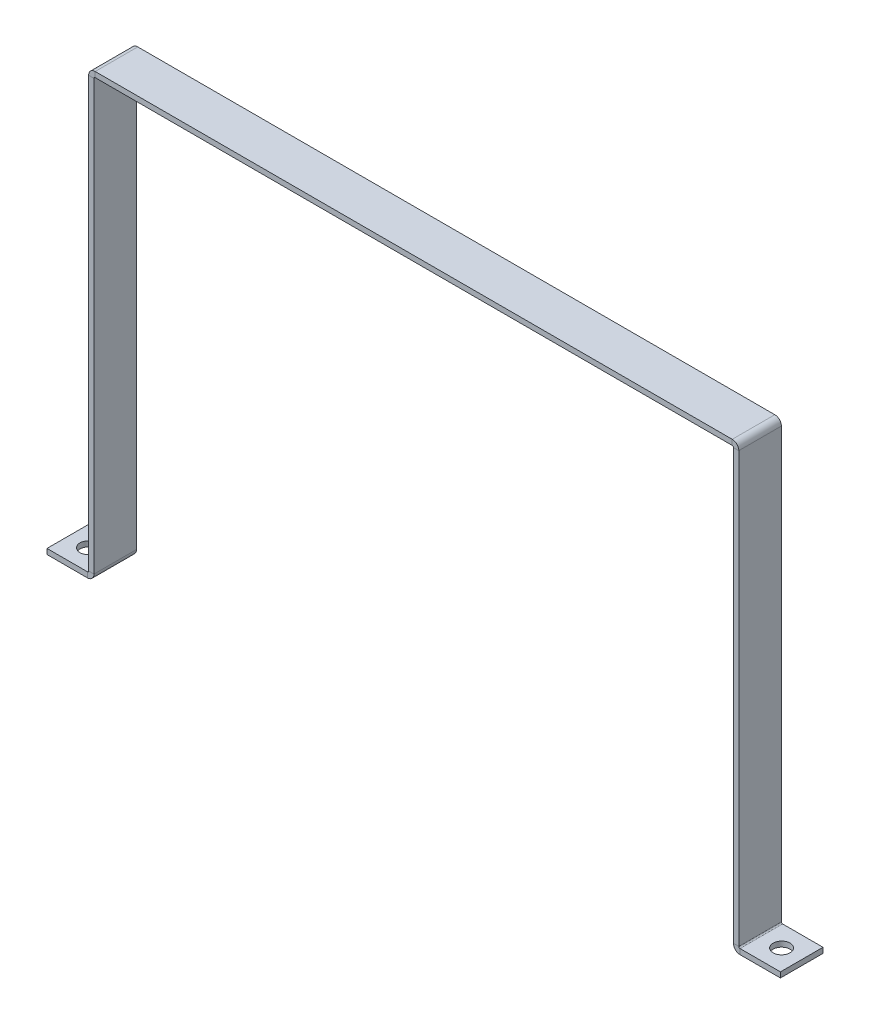
ISO-10303-21;
HEADER;
FILE_DESCRIPTION(('STEP AP214'),'2;1');
FILE_NAME('part.step','',(''),(''),'','','');
FILE_SCHEMA(('AUTOMOTIVE_DESIGN { 1 0 10303 214 1 1 1 1 }'));
ENDSEC;
DATA;
#1=APPLICATION_CONTEXT('core data for automotive mechanical design processes');
#2=APPLICATION_PROTOCOL_DEFINITION('international standard','automotive_design',2000,#1);
#3=PRODUCT_CONTEXT('',#1,'mechanical');
#4=PRODUCT('Part','Part','',(#3));
#5=PRODUCT_RELATED_PRODUCT_CATEGORY('part','',(#4));
#6=PRODUCT_DEFINITION_FORMATION('','',#4);
#7=PRODUCT_DEFINITION_CONTEXT('part definition',#1,'design');
#8=PRODUCT_DEFINITION('design','',#6,#7);
#9=PRODUCT_DEFINITION_SHAPE('','',#8);
#10=(LENGTH_UNIT() NAMED_UNIT(*) SI_UNIT(.MILLI.,.METRE.));
#11=(NAMED_UNIT(*) PLANE_ANGLE_UNIT() SI_UNIT($,.RADIAN.));
#12=(NAMED_UNIT(*) SI_UNIT($,.STERADIAN.) SOLID_ANGLE_UNIT());
#13=UNCERTAINTY_MEASURE_WITH_UNIT(LENGTH_MEASURE(1.E-05),#10,'distance_accuracy_value','');
#14=(GEOMETRIC_REPRESENTATION_CONTEXT(3) GLOBAL_UNCERTAINTY_ASSIGNED_CONTEXT((#13)) GLOBAL_UNIT_ASSIGNED_CONTEXT((#10,
#11,#12)) REPRESENTATION_CONTEXT('',''));
#15=CARTESIAN_POINT('',(0.,0.,0.));
#16=DIRECTION('',(0.,0.,1.));
#17=DIRECTION('',(1.,0.,0.));
#18=AXIS2_PLACEMENT_3D('',#15,#16,#17);
#19=CARTESIAN_POINT('',(-76.0798872180451,-3.175,25.4));
#20=DIRECTION('',(0.,1.,0.));
#21=DIRECTION('',(0.,0.,1.));
#22=AXIS2_PLACEMENT_3D('',#19,#20,#21);
#23=PLANE('',#22);
#24=DIRECTION('',(1.,0.,0.));
#25=VECTOR('',#24,1.);
#26=CARTESIAN_POINT('',(-76.0798872180451,-3.175,0.));
#27=LINE('',#26,#25);
#28=CARTESIAN_POINT('',(-76.0798872180451,-3.175,0.));
#29=VERTEX_POINT('',#28);
#30=CARTESIAN_POINT('',(303.920112781955,-3.17499999999999,0.));
#31=VERTEX_POINT('',#30);
#32=EDGE_CURVE('E221',#29,#31,#27,.T.);
#33=ORIENTED_EDGE('',*,*,#32,.T.);
#34=DIRECTION('',(0.,0.,-1.));
#35=VECTOR('',#34,1.);
#36=CARTESIAN_POINT('',(303.920112781955,-3.175,25.4));
#37=LINE('',#36,#35);
#38=CARTESIAN_POINT('',(303.920112781955,-3.17499999999999,25.4));
#39=VERTEX_POINT('',#38);
#40=EDGE_CURVE('E13',#39,#31,#37,.T.);
#41=ORIENTED_EDGE('',*,*,#40,.F.);
#42=DIRECTION('',(1.,0.,0.));
#43=VECTOR('',#42,1.);
#44=CARTESIAN_POINT('',(-76.0798872180451,-3.175,25.4));
#45=LINE('',#44,#43);
#46=CARTESIAN_POINT('',(-76.0798872180451,-3.175,25.4));
#47=VERTEX_POINT('',#46);
#48=EDGE_CURVE('E136',#47,#39,#45,.T.);
#49=ORIENTED_EDGE('',*,*,#48,.F.);
#50=DIRECTION('',(0.,0.,-1.));
#51=VECTOR('',#50,1.);
#52=CARTESIAN_POINT('',(-76.0798872180451,-3.175,25.4));
#53=LINE('',#52,#51);
#54=EDGE_CURVE('E234',#47,#29,#53,.T.);
#55=ORIENTED_EDGE('',*,*,#54,.T.);
#56=EDGE_LOOP('',(#33,#41,#49,#55));
#57=FACE_BOUND('',#56,.T.);
#58=ADVANCED_FACE('F120',(#57),#23,.F.);
#59=CARTESIAN_POINT('',(-76.0798872180451,0.,25.4));
#60=DIRECTION('',(0.,1.,0.));
#61=DIRECTION('',(0.,0.,1.));
#62=AXIS2_PLACEMENT_3D('',#59,#60,#61);
#63=PLANE('',#62);
#64=DIRECTION('',(1.,0.,0.));
#65=VECTOR('',#64,1.);
#66=CARTESIAN_POINT('',(-76.0798872180451,0.,0.));
#67=LINE('',#66,#65);
#68=CARTESIAN_POINT('',(-76.0798872180451,0.,0.));
#69=VERTEX_POINT('',#68);
#70=CARTESIAN_POINT('',(303.920112781955,0.,0.));
#71=VERTEX_POINT('',#70);
#72=EDGE_CURVE('E240',#69,#71,#67,.T.);
#73=ORIENTED_EDGE('',*,*,#72,.F.);
#74=DIRECTION('',(0.,0.,-1.));
#75=VECTOR('',#74,1.);
#76=CARTESIAN_POINT('',(-76.0798872180451,0.,25.4));
#77=LINE('',#76,#75);
#78=CARTESIAN_POINT('',(-76.0798872180451,0.,25.4));
#79=VERTEX_POINT('',#78);
#80=EDGE_CURVE('E246',#79,#69,#77,.T.);
#81=ORIENTED_EDGE('',*,*,#80,.F.);
#82=DIRECTION('',(1.,0.,0.));
#83=VECTOR('',#82,1.);
#84=CARTESIAN_POINT('',(-76.0798872180451,0.,25.4));
#85=LINE('',#84,#83);
#86=CARTESIAN_POINT('',(303.920112781955,0.,25.4));
#87=VERTEX_POINT('',#86);
#88=EDGE_CURVE('E228',#79,#87,#85,.T.);
#89=ORIENTED_EDGE('',*,*,#88,.T.);
#90=DIRECTION('',(0.,0.,-1.));
#91=VECTOR('',#90,1.);
#92=CARTESIAN_POINT('',(303.920112781955,0.,25.4));
#93=LINE('',#92,#91);
#94=EDGE_CURVE('E128',#87,#71,#93,.T.);
#95=ORIENTED_EDGE('',*,*,#94,.T.);
#96=EDGE_LOOP('',(#73,#81,#89,#95));
#97=FACE_BOUND('',#96,.T.);
#98=ADVANCED_FACE('F250',(#97),#63,.T.);
#99=CARTESIAN_POINT('',(0.,0.,25.4));
#100=DIRECTION('',(0.,0.,-1.));
#101=DIRECTION('',(-1.,0.,0.));
#102=AXIS2_PLACEMENT_3D('',#99,#100,#101);
#103=PLANE('',#102);
#104=ORIENTED_EDGE('',*,*,#48,.T.);
#105=DIRECTION('',(0.,-1.,0.));
#106=VECTOR('',#105,1.);
#107=CARTESIAN_POINT('',(303.920112781955,0.,25.4));
#108=LINE('',#107,#106);
#109=EDGE_CURVE('E192',#87,#39,#108,.T.);
#110=ORIENTED_EDGE('',*,*,#109,.F.);
#111=ORIENTED_EDGE('',*,*,#88,.F.);
#112=DIRECTION('',(0.,1.,0.));
#113=VECTOR('',#112,1.);
#114=CARTESIAN_POINT('',(-76.0798872180451,-3.175,25.4));
#115=LINE('',#114,#113);
#116=EDGE_CURVE('E231',#47,#79,#115,.T.);
#117=ORIENTED_EDGE('',*,*,#116,.F.);
#118=EDGE_LOOP('',(#104,#110,#111,#117));
#119=FACE_BOUND('',#118,.T.);
#120=ADVANCED_FACE('F337',(#119),#103,.F.);
#121=CARTESIAN_POINT('',(0.,0.,0.));
#122=DIRECTION('',(0.,0.,-1.));
#123=DIRECTION('',(-1.,0.,0.));
#124=AXIS2_PLACEMENT_3D('',#121,#122,#123);
#125=PLANE('',#124);
#126=ORIENTED_EDGE('',*,*,#32,.F.);
#127=DIRECTION('',(0.,1.,0.));
#128=VECTOR('',#127,1.);
#129=CARTESIAN_POINT('',(-76.0798872180451,-3.175,0.));
#130=LINE('',#129,#128);
#131=EDGE_CURVE('E226',#29,#69,#130,.T.);
#132=ORIENTED_EDGE('',*,*,#131,.T.);
#133=ORIENTED_EDGE('',*,*,#72,.T.);
#134=DIRECTION('',(0.,-1.,0.));
#135=VECTOR('',#134,1.);
#136=CARTESIAN_POINT('',(303.920112781955,0.,0.));
#137=LINE('',#136,#135);
#138=EDGE_CURVE('E237',#71,#31,#137,.T.);
#139=ORIENTED_EDGE('',*,*,#138,.T.);
#140=EDGE_LOOP('',(#126,#132,#133,#139));
#141=FACE_BOUND('',#140,.T.);
#142=ADVANCED_FACE('F255',(#141),#125,.T.);
#143=CARTESIAN_POINT('',(303.920112781955,-3.91159999999996,0.));
#144=DIRECTION('',(0.,0.,-1.));
#145=DIRECTION('',(-1.,0.,0.));
#146=AXIS2_PLACEMENT_3D('',#143,#144,#145);
#147=PLANE('',#146);
#148=DIRECTION('',(-1.,0.,0.));
#149=VECTOR('',#148,1.);
#150=CARTESIAN_POINT('',(307.831712781955,-3.91159999999995,0.));
#151=LINE('',#150,#149);
#152=CARTESIAN_POINT('',(304.656712781955,-3.91159999999996,0.));
#153=VERTEX_POINT('',#152);
#154=CARTESIAN_POINT('',(307.831712781955,-3.91159999999995,0.));
#155=VERTEX_POINT('',#154);
#156=EDGE_CURVE('E183',#153,#155,#151,.F.);
#157=ORIENTED_EDGE('',*,*,#156,.F.);
#158=CARTESIAN_POINT('',(303.920112781955,-3.91159999999996,0.));
#159=DIRECTION('',(0.,0.,1.));
#160=DIRECTION('',(1.,0.,0.));
#161=AXIS2_PLACEMENT_3D('',#158,#159,#160);
#162=CIRCLE('',#161,0.736599999999976);
#163=EDGE_CURVE('E177',#31,#153,#162,.F.);
#164=ORIENTED_EDGE('',*,*,#163,.F.);
#165=ORIENTED_EDGE('',*,*,#138,.F.);
#166=CARTESIAN_POINT('',(303.920112781955,-3.91159999999996,0.));
#167=DIRECTION('',(0.,0.,1.));
#168=DIRECTION('',(1.,0.,0.));
#169=AXIS2_PLACEMENT_3D('',#166,#167,#168);
#170=CIRCLE('',#169,3.91159999999998);
#171=EDGE_CURVE('E148',#71,#155,#170,.F.);
#172=ORIENTED_EDGE('',*,*,#171,.T.);
#173=EDGE_LOOP('',(#157,#164,#165,#172));
#174=FACE_BOUND('',#173,.T.);
#175=ADVANCED_FACE('F339',(#174),#147,.T.);
#176=CARTESIAN_POINT('',(303.920112781955,-3.91159999999996,25.4));
#177=DIRECTION('',(0.,0.,-1.));
#178=DIRECTION('',(-1.,0.,0.));
#179=AXIS2_PLACEMENT_3D('',#176,#177,#178);
#180=PLANE('',#179);
#181=CARTESIAN_POINT('',(303.920112781955,-3.91159999999996,25.4));
#182=DIRECTION('',(0.,0.,1.));
#183=DIRECTION('',(1.,0.,0.));
#184=AXIS2_PLACEMENT_3D('',#181,#182,#183);
#185=CIRCLE('',#184,0.736599999999976);
#186=CARTESIAN_POINT('',(304.656712781955,-3.91159999999996,25.4));
#187=VERTEX_POINT('',#186);
#188=EDGE_CURVE('E175',#187,#39,#185,.T.);
#189=ORIENTED_EDGE('',*,*,#188,.F.);
#190=DIRECTION('',(-1.,0.,0.));
#191=VECTOR('',#190,1.);
#192=CARTESIAN_POINT('',(304.656712781955,-3.91159999999996,25.4));
#193=LINE('',#192,#191);
#194=CARTESIAN_POINT('',(307.831712781955,-3.91159999999995,25.4));
#195=VERTEX_POINT('',#194);
#196=EDGE_CURVE('E182',#187,#195,#193,.F.);
#197=ORIENTED_EDGE('',*,*,#196,.T.);
#198=CARTESIAN_POINT('',(303.920112781955,-3.91159999999996,25.4));
#199=DIRECTION('',(0.,0.,1.));
#200=DIRECTION('',(1.,0.,0.));
#201=AXIS2_PLACEMENT_3D('',#198,#199,#200);
#202=CIRCLE('',#201,3.91159999999998);
#203=EDGE_CURVE('E222',#195,#87,#202,.T.);
#204=ORIENTED_EDGE('',*,*,#203,.T.);
#205=ORIENTED_EDGE('',*,*,#109,.T.);
#206=EDGE_LOOP('',(#189,#197,#204,#205));
#207=FACE_BOUND('',#206,.T.);
#208=ADVANCED_FACE('F188',(#207),#180,.F.);
#209=CARTESIAN_POINT('',(303.920112781955,-3.91159999999996,25.4));
#210=DIRECTION('',(0.,0.,1.));
#211=DIRECTION('',(1.,0.,0.));
#212=AXIS2_PLACEMENT_3D('',#209,#210,#211);
#213=CYLINDRICAL_SURFACE('',#212,3.91159999999998);
#214=ORIENTED_EDGE('',*,*,#94,.F.);
#215=ORIENTED_EDGE('',*,*,#203,.F.);
#216=DIRECTION('',(0.,0.,1.));
#217=VECTOR('',#216,1.);
#218=CARTESIAN_POINT('',(307.831712781955,-3.91159999999995,0.));
#219=LINE('',#218,#217);
#220=EDGE_CURVE('E205',#195,#155,#219,.F.);
#221=ORIENTED_EDGE('',*,*,#220,.T.);
#222=ORIENTED_EDGE('',*,*,#171,.F.);
#223=EDGE_LOOP('',(#214,#215,#221,#222));
#224=FACE_BOUND('',#223,.T.);
#225=ADVANCED_FACE('F335',(#224),#213,.T.);
#226=CARTESIAN_POINT('',(303.920112781955,-3.91159999999996,25.4));
#227=DIRECTION('',(0.,0.,1.));
#228=DIRECTION('',(1.,0.,0.));
#229=AXIS2_PLACEMENT_3D('',#226,#227,#228);
#230=CYLINDRICAL_SURFACE('',#229,0.736599999999976);
#231=ORIENTED_EDGE('',*,*,#40,.T.);
#232=ORIENTED_EDGE('',*,*,#163,.T.);
#233=DIRECTION('',(0.,0.,1.));
#234=VECTOR('',#233,1.);
#235=CARTESIAN_POINT('',(304.656712781955,-3.91159999999996,0.));
#236=LINE('',#235,#234);
#237=EDGE_CURVE('E172',#153,#187,#236,.T.);
#238=ORIENTED_EDGE('',*,*,#237,.T.);
#239=ORIENTED_EDGE('',*,*,#188,.T.);
#240=EDGE_LOOP('',(#231,#232,#238,#239));
#241=FACE_BOUND('',#240,.T.);
#242=ADVANCED_FACE('F174',(#241),#230,.F.);
#243=CARTESIAN_POINT('',(307.831712781956,-260.,25.4));
#244=DIRECTION('',(0.,0.,-1.));
#245=DIRECTION('',(0.,1.,0.));
#246=AXIS2_PLACEMENT_3D('',#243,#244,#245);
#247=PLANE('',#246);
#248=ORIENTED_EDGE('',*,*,#196,.F.);
#249=DIRECTION('',(0.,1.,0.));
#250=VECTOR('',#249,1.);
#251=CARTESIAN_POINT('',(304.656712781956,-260.,25.4));
#252=LINE('',#251,#250);
#253=CARTESIAN_POINT('',(304.656712781956,-260.,25.4));
#254=VERTEX_POINT('',#253);
#255=EDGE_CURVE('E201',#187,#254,#252,.F.);
#256=ORIENTED_EDGE('',*,*,#255,.T.);
#257=DIRECTION('',(-1.,0.,0.));
#258=VECTOR('',#257,1.);
#259=CARTESIAN_POINT('',(307.831712781956,-260.,25.4));
#260=LINE('',#259,#258);
#261=CARTESIAN_POINT('',(307.831712781956,-260.,25.4));
#262=VERTEX_POINT('',#261);
#263=EDGE_CURVE('E193',#262,#254,#260,.T.);
#264=ORIENTED_EDGE('',*,*,#263,.F.);
#265=DIRECTION('',(0.,-1.,0.));
#266=VECTOR('',#265,1.);
#267=CARTESIAN_POINT('',(307.831712781955,1.06007422681369E-12,25.4));
#268=LINE('',#267,#266);
#269=EDGE_CURVE('E204',#195,#262,#268,.T.);
#270=ORIENTED_EDGE('',*,*,#269,.F.);
#271=EDGE_LOOP('',(#248,#256,#264,#270));
#272=FACE_BOUND('',#271,.T.);
#273=ADVANCED_FACE('F198',(#272),#247,.F.);
#274=CARTESIAN_POINT('',(307.831712781955,-3.17499999999999,0.));
#275=DIRECTION('',(0.,0.,1.));
#276=DIRECTION('',(1.,0.,0.));
#277=AXIS2_PLACEMENT_3D('',#274,#275,#276);
#278=PLANE('',#277);
#279=ORIENTED_EDGE('',*,*,#156,.T.);
#280=DIRECTION('',(0.,1.,0.));
#281=VECTOR('',#280,1.);
#282=CARTESIAN_POINT('',(307.831712781955,1.06213299724289E-12,0.));
#283=LINE('',#282,#281);
#284=CARTESIAN_POINT('',(307.831712781956,-260.,0.));
#285=VERTEX_POINT('',#284);
#286=EDGE_CURVE('E291',#285,#155,#283,.T.);
#287=ORIENTED_EDGE('',*,*,#286,.F.);
#288=DIRECTION('',(-1.,0.,0.));
#289=VECTOR('',#288,1.);
#290=CARTESIAN_POINT('',(307.831712781956,-260.,0.));
#291=LINE('',#290,#289);
#292=CARTESIAN_POINT('',(304.656712781956,-260.,0.));
#293=VERTEX_POINT('',#292);
#294=EDGE_CURVE('E288',#285,#293,#291,.T.);
#295=ORIENTED_EDGE('',*,*,#294,.T.);
#296=DIRECTION('',(0.,-1.,0.));
#297=VECTOR('',#296,1.);
#298=CARTESIAN_POINT('',(304.656712781955,-3.175,0.));
#299=LINE('',#298,#297);
#300=EDGE_CURVE('E212',#293,#153,#299,.F.);
#301=ORIENTED_EDGE('',*,*,#300,.T.);
#302=EDGE_LOOP('',(#279,#287,#295,#301));
#303=FACE_BOUND('',#302,.T.);
#304=ADVANCED_FACE('F298',(#303),#278,.F.);
#305=CARTESIAN_POINT('',(307.831712781955,1.06213299724289E-12,0.));
#306=DIRECTION('',(-1.,0.,0.));
#307=DIRECTION('',(0.,-1.,0.));
#308=AXIS2_PLACEMENT_3D('',#305,#306,#307);
#309=PLANE('',#308);
#310=ORIENTED_EDGE('',*,*,#220,.F.);
#311=ORIENTED_EDGE('',*,*,#269,.T.);
#312=DIRECTION('',(0.,0.,-1.));
#313=VECTOR('',#312,1.);
#314=CARTESIAN_POINT('',(307.831712781956,-260.,0.));
#315=LINE('',#314,#313);
#316=EDGE_CURVE('E294',#262,#285,#315,.T.);
#317=ORIENTED_EDGE('',*,*,#316,.T.);
#318=ORIENTED_EDGE('',*,*,#286,.T.);
#319=EDGE_LOOP('',(#310,#311,#317,#318));
#320=FACE_BOUND('',#319,.T.);
#321=ADVANCED_FACE('F456',(#320),#309,.F.);
#322=CARTESIAN_POINT('',(304.656712781955,1.05104754399206E-12,0.));
#323=DIRECTION('',(-1.,0.,0.));
#324=DIRECTION('',(0.,-1.,0.));
#325=AXIS2_PLACEMENT_3D('',#322,#323,#324);
#326=PLANE('',#325);
#327=ORIENTED_EDGE('',*,*,#255,.F.);
#328=ORIENTED_EDGE('',*,*,#237,.F.);
#329=ORIENTED_EDGE('',*,*,#300,.F.);
#330=DIRECTION('',(0.,0.,1.));
#331=VECTOR('',#330,1.);
#332=CARTESIAN_POINT('',(304.656712781956,-260.,0.));
#333=LINE('',#332,#331);
#334=EDGE_CURVE('E209',#254,#293,#333,.F.);
#335=ORIENTED_EDGE('',*,*,#334,.F.);
#336=EDGE_LOOP('',(#327,#328,#329,#335));
#337=FACE_BOUND('',#336,.T.);
#338=ADVANCED_FACE('F207',(#337),#326,.T.);
#339=CARTESIAN_POINT('',(-76.0798872180451,-3.9116,25.4));
#340=DIRECTION('',(0.,0.,1.));
#341=DIRECTION('',(1.,0.,0.));
#342=AXIS2_PLACEMENT_3D('',#339,#340,#341);
#343=PLANE('',#342);
#344=DIRECTION('',(1.,0.,0.));
#345=VECTOR('',#344,1.);
#346=CARTESIAN_POINT('',(-79.9914872180451,-3.91159999999999,25.4));
#347=LINE('',#346,#345);
#348=CARTESIAN_POINT('',(-76.8164872180451,-3.9116,25.4));
#349=VERTEX_POINT('',#348);
#350=CARTESIAN_POINT('',(-79.9914872180451,-3.91159999999999,25.4));
#351=VERTEX_POINT('',#350);
#352=EDGE_CURVE('E839',#349,#351,#347,.F.);
#353=ORIENTED_EDGE('',*,*,#352,.F.);
#354=CARTESIAN_POINT('',(-76.0798872180451,-3.9116,25.4));
#355=DIRECTION('',(0.,0.,-1.));
#356=DIRECTION('',(-1.,0.,0.));
#357=AXIS2_PLACEMENT_3D('',#354,#355,#356);
#358=CIRCLE('',#357,0.736600000000004);
#359=EDGE_CURVE('E278',#47,#349,#358,.F.);
#360=ORIENTED_EDGE('',*,*,#359,.F.);
#361=ORIENTED_EDGE('',*,*,#116,.T.);
#362=CARTESIAN_POINT('',(-76.0798872180451,-3.9116,25.4));
#363=DIRECTION('',(0.,0.,-1.));
#364=DIRECTION('',(-1.,0.,0.));
#365=AXIS2_PLACEMENT_3D('',#362,#363,#364);
#366=CIRCLE('',#365,3.9116);
#367=EDGE_CURVE('E219',#79,#351,#366,.F.);
#368=ORIENTED_EDGE('',*,*,#367,.T.);
#369=EDGE_LOOP('',(#353,#360,#361,#368));
#370=FACE_BOUND('',#369,.T.);
#371=ADVANCED_FACE('F400',(#370),#343,.T.);
#372=CARTESIAN_POINT('',(-76.0798872180451,-3.9116,0.));
#373=DIRECTION('',(0.,0.,1.));
#374=DIRECTION('',(1.,0.,0.));
#375=AXIS2_PLACEMENT_3D('',#372,#373,#374);
#376=PLANE('',#375);
#377=CARTESIAN_POINT('',(-76.0798872180451,-3.9116,0.));
#378=DIRECTION('',(0.,0.,-1.));
#379=DIRECTION('',(-1.,0.,0.));
#380=AXIS2_PLACEMENT_3D('',#377,#378,#379);
#381=CIRCLE('',#380,0.736600000000004);
#382=CARTESIAN_POINT('',(-76.8164872180451,-3.9116,0.));
#383=VERTEX_POINT('',#382);
#384=EDGE_CURVE('E266',#383,#29,#381,.T.);
#385=ORIENTED_EDGE('',*,*,#384,.F.);
#386=DIRECTION('',(1.,0.,0.));
#387=VECTOR('',#386,1.);
#388=CARTESIAN_POINT('',(-76.8164872180451,-3.9116,0.));
#389=LINE('',#388,#387);
#390=CARTESIAN_POINT('',(-79.9914872180451,-3.91159999999999,0.));
#391=VERTEX_POINT('',#390);
#392=EDGE_CURVE('E867',#383,#391,#389,.F.);
#393=ORIENTED_EDGE('',*,*,#392,.T.);
#394=CARTESIAN_POINT('',(-76.0798872180451,-3.9116,0.));
#395=DIRECTION('',(0.,0.,-1.));
#396=DIRECTION('',(-1.,0.,0.));
#397=AXIS2_PLACEMENT_3D('',#394,#395,#396);
#398=CIRCLE('',#397,3.9116);
#399=EDGE_CURVE('E269',#391,#69,#398,.T.);
#400=ORIENTED_EDGE('',*,*,#399,.T.);
#401=ORIENTED_EDGE('',*,*,#131,.F.);
#402=EDGE_LOOP('',(#385,#393,#400,#401));
#403=FACE_BOUND('',#402,.T.);
#404=ADVANCED_FACE('F263',(#403),#376,.F.);
#405=CARTESIAN_POINT('',(-76.0798872180451,-3.9116,0.));
#406=DIRECTION('',(0.,0.,-1.));
#407=DIRECTION('',(-1.,0.,0.));
#408=AXIS2_PLACEMENT_3D('',#405,#406,#407);
#409=CYLINDRICAL_SURFACE('',#408,3.9116);
#410=ORIENTED_EDGE('',*,*,#80,.T.);
#411=ORIENTED_EDGE('',*,*,#399,.F.);
#412=DIRECTION('',(0.,0.,-1.));
#413=VECTOR('',#412,1.);
#414=CARTESIAN_POINT('',(-79.9914872180451,-3.91159999999999,25.4));
#415=LINE('',#414,#413);
#416=EDGE_CURVE('E865',#391,#351,#415,.F.);
#417=ORIENTED_EDGE('',*,*,#416,.T.);
#418=ORIENTED_EDGE('',*,*,#367,.F.);
#419=EDGE_LOOP('',(#410,#411,#417,#418));
#420=FACE_BOUND('',#419,.T.);
#421=ADVANCED_FACE('F417',(#420),#409,.T.);
#422=CARTESIAN_POINT('',(-76.0798872180451,-3.9116,0.));
#423=DIRECTION('',(0.,0.,-1.));
#424=DIRECTION('',(-1.,0.,0.));
#425=AXIS2_PLACEMENT_3D('',#422,#423,#424);
#426=CYLINDRICAL_SURFACE('',#425,0.736600000000004);
#427=ORIENTED_EDGE('',*,*,#54,.F.);
#428=ORIENTED_EDGE('',*,*,#359,.T.);
#429=DIRECTION('',(0.,0.,-1.));
#430=VECTOR('',#429,1.);
#431=CARTESIAN_POINT('',(-76.8164872180451,-3.9116,25.4));
#432=LINE('',#431,#430);
#433=EDGE_CURVE('E277',#349,#383,#432,.T.);
#434=ORIENTED_EDGE('',*,*,#433,.T.);
#435=ORIENTED_EDGE('',*,*,#384,.T.);
#436=EDGE_LOOP('',(#427,#428,#434,#435));
#437=FACE_BOUND('',#436,.T.);
#438=ADVANCED_FACE('F273',(#437),#426,.F.);
#439=CARTESIAN_POINT('',(-79.9914872180451,-3.17499999999999,25.4));
#440=DIRECTION('',(0.,0.,-1.));
#441=DIRECTION('',(-1.,0.,0.));
#442=AXIS2_PLACEMENT_3D('',#439,#440,#441);
#443=PLANE('',#442);
#444=ORIENTED_EDGE('',*,*,#352,.T.);
#445=DIRECTION('',(0.,1.,0.));
#446=VECTOR('',#445,1.);
#447=CARTESIAN_POINT('',(-79.9914872180451,2.78303732357384E-13,25.4));
#448=LINE('',#447,#446);
#449=CARTESIAN_POINT('',(-79.991487218046,-260.,25.4));
#450=VERTEX_POINT('',#449);
#451=EDGE_CURVE('E854',#450,#351,#448,.T.);
#452=ORIENTED_EDGE('',*,*,#451,.F.);
#453=DIRECTION('',(1.,0.,0.));
#454=VECTOR('',#453,1.);
#455=CARTESIAN_POINT('',(-79.991487218046,-260.,25.4));
#456=LINE('',#455,#454);
#457=CARTESIAN_POINT('',(-76.816487218046,-260.,25.4));
#458=VERTEX_POINT('',#457);
#459=EDGE_CURVE('E283',#450,#458,#456,.T.);
#460=ORIENTED_EDGE('',*,*,#459,.T.);
#461=DIRECTION('',(0.,-1.,0.));
#462=VECTOR('',#461,1.);
#463=CARTESIAN_POINT('',(-76.8164872180451,-3.175,25.4));
#464=LINE('',#463,#462);
#465=EDGE_CURVE('E862',#458,#349,#464,.F.);
#466=ORIENTED_EDGE('',*,*,#465,.T.);
#467=EDGE_LOOP('',(#444,#452,#460,#466));
#468=FACE_BOUND('',#467,.T.);
#469=ADVANCED_FACE('F437',(#468),#443,.F.);
#470=CARTESIAN_POINT('',(-79.991487218046,-260.,0.));
#471=DIRECTION('',(0.,0.,1.));
#472=DIRECTION('',(1.,0.,0.));
#473=AXIS2_PLACEMENT_3D('',#470,#471,#472);
#474=PLANE('',#473);
#475=ORIENTED_EDGE('',*,*,#392,.F.);
#476=DIRECTION('',(0.,1.,0.));
#477=VECTOR('',#476,1.);
#478=CARTESIAN_POINT('',(-76.816487218046,-260.,0.));
#479=LINE('',#478,#477);
#480=CARTESIAN_POINT('',(-76.816487218046,-260.,0.));
#481=VERTEX_POINT('',#480);
#482=EDGE_CURVE('E860',#383,#481,#479,.F.);
#483=ORIENTED_EDGE('',*,*,#482,.T.);
#484=DIRECTION('',(1.,0.,0.));
#485=VECTOR('',#484,1.);
#486=CARTESIAN_POINT('',(-79.991487218046,-260.,0.));
#487=LINE('',#486,#485);
#488=CARTESIAN_POINT('',(-79.991487218046,-260.,0.));
#489=VERTEX_POINT('',#488);
#490=EDGE_CURVE('E279',#489,#481,#487,.T.);
#491=ORIENTED_EDGE('',*,*,#490,.F.);
#492=DIRECTION('',(0.,-1.,0.));
#493=VECTOR('',#492,1.);
#494=CARTESIAN_POINT('',(-79.9914872180451,2.78303732357384E-13,0.));
#495=LINE('',#494,#493);
#496=EDGE_CURVE('E852',#391,#489,#495,.T.);
#497=ORIENTED_EDGE('',*,*,#496,.F.);
#498=EDGE_LOOP('',(#475,#483,#491,#497));
#499=FACE_BOUND('',#498,.T.);
#500=ADVANCED_FACE('F481',(#499),#474,.F.);
#501=CARTESIAN_POINT('',(-79.9914872180451,2.78303732357384E-13,0.));
#502=DIRECTION('',(1.,0.,0.));
#503=DIRECTION('',(0.,1.,0.));
#504=AXIS2_PLACEMENT_3D('',#501,#502,#503);
#505=PLANE('',#504);
#506=ORIENTED_EDGE('',*,*,#416,.F.);
#507=ORIENTED_EDGE('',*,*,#496,.T.);
#508=DIRECTION('',(0.,0.,1.));
#509=VECTOR('',#508,1.);
#510=CARTESIAN_POINT('',(-79.991487218046,-260.,0.));
#511=LINE('',#510,#509);
#512=EDGE_CURVE('E850',#489,#450,#511,.T.);
#513=ORIENTED_EDGE('',*,*,#512,.T.);
#514=ORIENTED_EDGE('',*,*,#451,.T.);
#515=EDGE_LOOP('',(#506,#507,#513,#514));
#516=FACE_BOUND('',#515,.T.);
#517=ADVANCED_FACE('F492',(#516),#505,.F.);
#518=CARTESIAN_POINT('',(-76.8164872180451,2.67218279106557E-13,0.));
#519=DIRECTION('',(1.,0.,0.));
#520=DIRECTION('',(0.,1.,0.));
#521=AXIS2_PLACEMENT_3D('',#518,#519,#520);
#522=PLANE('',#521);
#523=ORIENTED_EDGE('',*,*,#482,.F.);
#524=ORIENTED_EDGE('',*,*,#433,.F.);
#525=ORIENTED_EDGE('',*,*,#465,.F.);
#526=DIRECTION('',(0.,0.,-1.));
#527=VECTOR('',#526,1.);
#528=CARTESIAN_POINT('',(-76.816487218046,-260.,25.4));
#529=LINE('',#528,#527);
#530=EDGE_CURVE('E857',#481,#458,#529,.F.);
#531=ORIENTED_EDGE('',*,*,#530,.F.);
#532=EDGE_LOOP('',(#523,#524,#525,#531));
#533=FACE_BOUND('',#532,.T.);
#534=ADVANCED_FACE('F503',(#533),#522,.T.);
#535=CARTESIAN_POINT('',(308.568312781956,-260.,25.4));
#536=DIRECTION('',(0.,0.,1.));
#537=DIRECTION('',(1.,0.,0.));
#538=AXIS2_PLACEMENT_3D('',#535,#536,#537);
#539=PLANE('',#538);
#540=DIRECTION('',(0.,1.,0.));
#541=VECTOR('',#540,1.);
#542=CARTESIAN_POINT('',(308.568312781956,-263.9116,25.4));
#543=LINE('',#542,#541);
#544=CARTESIAN_POINT('',(308.568312781956,-260.7366,25.4));
#545=VERTEX_POINT('',#544);
#546=CARTESIAN_POINT('',(308.568312781956,-263.9116,25.4));
#547=VERTEX_POINT('',#546);
#548=EDGE_CURVE('E793',#545,#547,#543,.F.);
#549=ORIENTED_EDGE('',*,*,#548,.F.);
#550=CARTESIAN_POINT('',(308.568312781956,-260.,25.4));
#551=DIRECTION('',(0.,0.,-1.));
#552=DIRECTION('',(-1.,0.,0.));
#553=AXIS2_PLACEMENT_3D('',#550,#551,#552);
#554=CIRCLE('',#553,0.736599999999976);
#555=EDGE_CURVE('E843',#262,#545,#554,.F.);
#556=ORIENTED_EDGE('',*,*,#555,.F.);
#557=ORIENTED_EDGE('',*,*,#263,.T.);
#558=CARTESIAN_POINT('',(308.568312781956,-260.,25.4));
#559=DIRECTION('',(0.,0.,-1.));
#560=DIRECTION('',(-1.,0.,0.));
#561=AXIS2_PLACEMENT_3D('',#558,#559,#560);
#562=CIRCLE('',#561,3.91159999999998);
#563=EDGE_CURVE('E836',#254,#547,#562,.F.);
#564=ORIENTED_EDGE('',*,*,#563,.T.);
#565=EDGE_LOOP('',(#549,#556,#557,#564));
#566=FACE_BOUND('',#565,.T.);
#567=ADVANCED_FACE('F514',(#566),#539,.T.);
#568=CARTESIAN_POINT('',(308.568312781956,-260.,0.));
#569=DIRECTION('',(0.,0.,1.));
#570=DIRECTION('',(1.,0.,0.));
#571=AXIS2_PLACEMENT_3D('',#568,#569,#570);
#572=PLANE('',#571);
#573=CARTESIAN_POINT('',(308.568312781956,-260.,0.));
#574=DIRECTION('',(0.,0.,-1.));
#575=DIRECTION('',(-1.,0.,0.));
#576=AXIS2_PLACEMENT_3D('',#573,#574,#575);
#577=CIRCLE('',#576,0.736599999999976);
#578=CARTESIAN_POINT('',(308.568312781956,-260.7366,0.));
#579=VERTEX_POINT('',#578);
#580=EDGE_CURVE('E805',#579,#285,#577,.T.);
#581=ORIENTED_EDGE('',*,*,#580,.F.);
#582=DIRECTION('',(0.,1.,0.));
#583=VECTOR('',#582,1.);
#584=CARTESIAN_POINT('',(308.568312781956,-260.7366,0.));
#585=LINE('',#584,#583);
#586=CARTESIAN_POINT('',(308.568312781956,-263.9116,0.));
#587=VERTEX_POINT('',#586);
#588=EDGE_CURVE('E829',#579,#587,#585,.F.);
#589=ORIENTED_EDGE('',*,*,#588,.T.);
#590=CARTESIAN_POINT('',(308.568312781956,-260.,0.));
#591=DIRECTION('',(0.,0.,-1.));
#592=DIRECTION('',(-1.,0.,0.));
#593=AXIS2_PLACEMENT_3D('',#590,#591,#592);
#594=CIRCLE('',#593,3.91159999999998);
#595=EDGE_CURVE('E840',#587,#293,#594,.T.);
#596=ORIENTED_EDGE('',*,*,#595,.T.);
#597=ORIENTED_EDGE('',*,*,#294,.F.);
#598=EDGE_LOOP('',(#581,#589,#596,#597));
#599=FACE_BOUND('',#598,.T.);
#600=ADVANCED_FACE('F525',(#599),#572,.F.);
#601=CARTESIAN_POINT('',(308.568312781956,-260.,0.));
#602=DIRECTION('',(0.,0.,-1.));
#603=DIRECTION('',(0.,-1.,0.));
#604=AXIS2_PLACEMENT_3D('',#601,#602,#603);
#605=CYLINDRICAL_SURFACE('',#604,3.91159999999998);
#606=ORIENTED_EDGE('',*,*,#334,.T.);
#607=ORIENTED_EDGE('',*,*,#595,.F.);
#608=DIRECTION('',(0.,0.,-1.));
#609=VECTOR('',#608,1.);
#610=CARTESIAN_POINT('',(308.568312781956,-263.9116,25.4));
#611=LINE('',#610,#609);
#612=EDGE_CURVE('E827',#587,#547,#611,.F.);
#613=ORIENTED_EDGE('',*,*,#612,.T.);
#614=ORIENTED_EDGE('',*,*,#563,.F.);
#615=EDGE_LOOP('',(#606,#607,#613,#614));
#616=FACE_BOUND('',#615,.T.);
#617=ADVANCED_FACE('F536',(#616),#605,.T.);
#618=CARTESIAN_POINT('',(308.568312781956,-260.,0.));
#619=DIRECTION('',(0.,0.,-1.));
#620=DIRECTION('',(0.,-1.,0.));
#621=AXIS2_PLACEMENT_3D('',#618,#619,#620);
#622=CYLINDRICAL_SURFACE('',#621,0.736599999999976);
#623=ORIENTED_EDGE('',*,*,#316,.F.);
#624=ORIENTED_EDGE('',*,*,#555,.T.);
#625=DIRECTION('',(0.,0.,-1.));
#626=VECTOR('',#625,1.);
#627=CARTESIAN_POINT('',(308.568312781956,-260.7366,25.4));
#628=LINE('',#627,#626);
#629=EDGE_CURVE('E832',#545,#579,#628,.T.);
#630=ORIENTED_EDGE('',*,*,#629,.T.);
#631=ORIENTED_EDGE('',*,*,#580,.T.);
#632=EDGE_LOOP('',(#623,#624,#630,#631));
#633=FACE_BOUND('',#632,.T.);
#634=ADVANCED_FACE('F547',(#633),#622,.F.);
#635=CARTESIAN_POINT('',(332.656712781956,-263.9116,0.));
#636=DIRECTION('',(0.,0.,1.));
#637=DIRECTION('',(1.,0.,0.));
#638=AXIS2_PLACEMENT_3D('',#635,#636,#637);
#639=PLANE('',#638);
#640=ORIENTED_EDGE('',*,*,#588,.F.);
#641=DIRECTION('',(-1.,0.,0.));
#642=VECTOR('',#641,1.);
#643=CARTESIAN_POINT('',(332.656712781956,-260.7366,0.));
#644=LINE('',#643,#642);
#645=CARTESIAN_POINT('',(332.656712781956,-260.7366,0.));
#646=VERTEX_POINT('',#645);
#647=EDGE_CURVE('E824',#579,#646,#644,.F.);
#648=ORIENTED_EDGE('',*,*,#647,.T.);
#649=DIRECTION('',(0.,1.,0.));
#650=VECTOR('',#649,1.);
#651=CARTESIAN_POINT('',(332.656712781956,-263.9116,0.));
#652=LINE('',#651,#650);
#653=CARTESIAN_POINT('',(332.656712781956,-263.9116,0.));
#654=VERTEX_POINT('',#653);
#655=EDGE_CURVE('E802',#654,#646,#652,.T.);
#656=ORIENTED_EDGE('',*,*,#655,.F.);
#657=DIRECTION('',(1.,0.,0.));
#658=VECTOR('',#657,1.);
#659=CARTESIAN_POINT('',(0.,-263.9116,0.));
#660=LINE('',#659,#658);
#661=EDGE_CURVE('E815',#587,#654,#660,.T.);
#662=ORIENTED_EDGE('',*,*,#661,.F.);
#663=EDGE_LOOP('',(#640,#648,#656,#662));
#664=FACE_BOUND('',#663,.T.);
#665=ADVANCED_FACE('F558',(#664),#639,.F.);
#666=CARTESIAN_POINT('',(307.831712781956,-263.9116,25.4));
#667=DIRECTION('',(0.,0.,-1.));
#668=DIRECTION('',(-1.,0.,0.));
#669=AXIS2_PLACEMENT_3D('',#666,#667,#668);
#670=PLANE('',#669);
#671=ORIENTED_EDGE('',*,*,#548,.T.);
#672=DIRECTION('',(-1.,0.,0.));
#673=VECTOR('',#672,1.);
#674=CARTESIAN_POINT('',(0.,-263.9116,25.4));
#675=LINE('',#674,#673);
#676=CARTESIAN_POINT('',(332.656712781956,-263.9116,25.4));
#677=VERTEX_POINT('',#676);
#678=EDGE_CURVE('E809',#677,#547,#675,.T.);
#679=ORIENTED_EDGE('',*,*,#678,.F.);
#680=DIRECTION('',(0.,1.,0.));
#681=VECTOR('',#680,1.);
#682=CARTESIAN_POINT('',(332.656712781956,-263.9116,25.4));
#683=LINE('',#682,#681);
#684=CARTESIAN_POINT('',(332.656712781956,-260.7366,25.4));
#685=VERTEX_POINT('',#684);
#686=EDGE_CURVE('E806',#677,#685,#683,.T.);
#687=ORIENTED_EDGE('',*,*,#686,.T.);
#688=DIRECTION('',(1.,0.,0.));
#689=VECTOR('',#688,1.);
#690=CARTESIAN_POINT('',(307.831712781956,-260.7366,25.4));
#691=LINE('',#690,#689);
#692=EDGE_CURVE('E818',#685,#545,#691,.F.);
#693=ORIENTED_EDGE('',*,*,#692,.T.);
#694=EDGE_LOOP('',(#671,#679,#687,#693));
#695=FACE_BOUND('',#694,.T.);
#696=ADVANCED_FACE('F569',(#695),#670,.F.);
#697=CARTESIAN_POINT('',(0.,-263.9116,0.));
#698=DIRECTION('',(0.,1.,0.));
#699=DIRECTION('',(0.,0.,1.));
#700=AXIS2_PLACEMENT_3D('',#697,#698,#699);
#701=PLANE('',#700);
#702=CARTESIAN_POINT('',(320.656712781956,-263.9116,12.7));
#703=DIRECTION('',(0.,-1.,0.));
#704=DIRECTION('',(0.,0.,-1.));
#705=AXIS2_PLACEMENT_3D('',#702,#703,#704);
#706=CIRCLE('',#705,5.04189999999999);
#707=CARTESIAN_POINT('',(320.656712781956,-263.9116,7.65810000000006));
#708=VERTEX_POINT('',#707);
#709=EDGE_CURVE('E745',#708,#708,#706,.T.);
#710=ORIENTED_EDGE('',*,*,#709,.F.);
#711=EDGE_LOOP('',(#710));
#712=FACE_BOUND('',#711,.T.);
#713=ORIENTED_EDGE('',*,*,#612,.F.);
#714=ORIENTED_EDGE('',*,*,#661,.T.);
#715=DIRECTION('',(0.,0.,1.));
#716=VECTOR('',#715,1.);
#717=CARTESIAN_POINT('',(332.656712781956,-263.9116,0.));
#718=LINE('',#717,#716);
#719=EDGE_CURVE('E812',#654,#677,#718,.T.);
#720=ORIENTED_EDGE('',*,*,#719,.T.);
#721=ORIENTED_EDGE('',*,*,#678,.T.);
#722=EDGE_LOOP('',(#713,#714,#720,#721));
#723=FACE_BOUND('',#722,.T.);
#724=ADVANCED_FACE('F580',(#712,#723),#701,.F.);
#725=CARTESIAN_POINT('',(0.,-260.7366,0.));
#726=DIRECTION('',(0.,1.,0.));
#727=DIRECTION('',(0.,0.,1.));
#728=AXIS2_PLACEMENT_3D('',#725,#726,#727);
#729=PLANE('',#728);
#730=CARTESIAN_POINT('',(320.656712781956,-260.7366,12.7));
#731=DIRECTION('',(0.,1.,0.));
#732=DIRECTION('',(0.,0.,1.));
#733=AXIS2_PLACEMENT_3D('',#730,#731,#732);
#734=CIRCLE('',#733,5.04189999999996);
#735=CARTESIAN_POINT('',(320.656712781956,-260.7366,17.7419));
#736=VERTEX_POINT('',#735);
#737=EDGE_CURVE('E750',#736,#736,#734,.T.);
#738=ORIENTED_EDGE('',*,*,#737,.F.);
#739=EDGE_LOOP('',(#738));
#740=FACE_BOUND('',#739,.T.);
#741=ORIENTED_EDGE('',*,*,#647,.F.);
#742=ORIENTED_EDGE('',*,*,#629,.F.);
#743=ORIENTED_EDGE('',*,*,#692,.F.);
#744=DIRECTION('',(0.,0.,-1.));
#745=VECTOR('',#744,1.);
#746=CARTESIAN_POINT('',(332.656712781956,-260.7366,25.4));
#747=LINE('',#746,#745);
#748=EDGE_CURVE('E821',#646,#685,#747,.F.);
#749=ORIENTED_EDGE('',*,*,#748,.F.);
#750=EDGE_LOOP('',(#741,#742,#743,#749));
#751=FACE_BOUND('',#750,.T.);
#752=ADVANCED_FACE('F595',(#740,#751),#729,.T.);
#753=CARTESIAN_POINT('',(332.656712781956,-263.9116,25.4));
#754=DIRECTION('',(-1.,0.,0.));
#755=DIRECTION('',(0.,-1.,0.));
#756=AXIS2_PLACEMENT_3D('',#753,#754,#755);
#757=PLANE('',#756);
#758=ORIENTED_EDGE('',*,*,#748,.T.);
#759=ORIENTED_EDGE('',*,*,#686,.F.);
#760=ORIENTED_EDGE('',*,*,#719,.F.);
#761=ORIENTED_EDGE('',*,*,#655,.T.);
#762=EDGE_LOOP('',(#758,#759,#760,#761));
#763=FACE_BOUND('',#762,.T.);
#764=ADVANCED_FACE('F589',(#763),#757,.F.);
#765=CARTESIAN_POINT('',(-80.728087218046,-260.,0.));
#766=DIRECTION('',(0.,0.,-1.));
#767=DIRECTION('',(-1.,0.,0.));
#768=AXIS2_PLACEMENT_3D('',#765,#766,#767);
#769=PLANE('',#768);
#770=DIRECTION('',(0.,1.,0.));
#771=VECTOR('',#770,1.);
#772=CARTESIAN_POINT('',(-80.728087218046,-263.9116,0.));
#773=LINE('',#772,#771);
#774=CARTESIAN_POINT('',(-80.728087218046,-260.7366,0.));
#775=VERTEX_POINT('',#774);
#776=CARTESIAN_POINT('',(-80.728087218046,-263.9116,0.));
#777=VERTEX_POINT('',#776);
#778=EDGE_CURVE('E753',#775,#777,#773,.F.);
#779=ORIENTED_EDGE('',*,*,#778,.F.);
#780=CARTESIAN_POINT('',(-80.728087218046,-260.,0.));
#781=DIRECTION('',(0.,0.,1.));
#782=DIRECTION('',(1.,0.,0.));
#783=AXIS2_PLACEMENT_3D('',#780,#781,#782);
#784=CIRCLE('',#783,0.736599999999976);
#785=EDGE_CURVE('E797',#489,#775,#784,.F.);
#786=ORIENTED_EDGE('',*,*,#785,.F.);
#787=ORIENTED_EDGE('',*,*,#490,.T.);
#788=CARTESIAN_POINT('',(-80.728087218046,-260.,0.));
#789=DIRECTION('',(0.,0.,1.));
#790=DIRECTION('',(1.,0.,0.));
#791=AXIS2_PLACEMENT_3D('',#788,#789,#790);
#792=CIRCLE('',#791,3.91159999999998);
#793=EDGE_CURVE('E790',#481,#777,#792,.F.);
#794=ORIENTED_EDGE('',*,*,#793,.T.);
#795=EDGE_LOOP('',(#779,#786,#787,#794));
#796=FACE_BOUND('',#795,.T.);
#797=ADVANCED_FACE('F594',(#796),#769,.T.);
#798=CARTESIAN_POINT('',(-80.728087218046,-260.,25.4));
#799=DIRECTION('',(0.,0.,-1.));
#800=DIRECTION('',(-1.,0.,0.));
#801=AXIS2_PLACEMENT_3D('',#798,#799,#800);
#802=PLANE('',#801);
#803=CARTESIAN_POINT('',(-80.728087218046,-260.,25.4));
#804=DIRECTION('',(0.,0.,1.));
#805=DIRECTION('',(1.,0.,0.));
#806=AXIS2_PLACEMENT_3D('',#803,#804,#805);
#807=CIRCLE('',#806,0.736599999999976);
#808=CARTESIAN_POINT('',(-80.728087218046,-260.7366,25.4));
#809=VERTEX_POINT('',#808);
#810=EDGE_CURVE('E757',#809,#450,#807,.T.);
#811=ORIENTED_EDGE('',*,*,#810,.F.);
#812=DIRECTION('',(0.,1.,0.));
#813=VECTOR('',#812,1.);
#814=CARTESIAN_POINT('',(-80.728087218046,-260.7366,25.4));
#815=LINE('',#814,#813);
#816=CARTESIAN_POINT('',(-80.728087218046,-263.9116,25.4));
#817=VERTEX_POINT('',#816);
#818=EDGE_CURVE('E782',#809,#817,#815,.F.);
#819=ORIENTED_EDGE('',*,*,#818,.T.);
#820=CARTESIAN_POINT('',(-80.728087218046,-260.,25.4));
#821=DIRECTION('',(0.,0.,1.));
#822=DIRECTION('',(1.,0.,0.));
#823=AXIS2_PLACEMENT_3D('',#820,#821,#822);
#824=CIRCLE('',#823,3.91159999999998);
#825=EDGE_CURVE('E794',#817,#458,#824,.T.);
#826=ORIENTED_EDGE('',*,*,#825,.T.);
#827=ORIENTED_EDGE('',*,*,#459,.F.);
#828=EDGE_LOOP('',(#811,#819,#826,#827));
#829=FACE_BOUND('',#828,.T.);
#830=ADVANCED_FACE('F608',(#829),#802,.F.);
#831=CARTESIAN_POINT('',(-80.728087218046,-260.,25.4));
#832=DIRECTION('',(0.,0.,1.));
#833=DIRECTION('',(0.,-1.,0.));
#834=AXIS2_PLACEMENT_3D('',#831,#832,#833);
#835=CYLINDRICAL_SURFACE('',#834,3.91159999999998);
#836=ORIENTED_EDGE('',*,*,#530,.T.);
#837=ORIENTED_EDGE('',*,*,#825,.F.);
#838=DIRECTION('',(0.,0.,1.));
#839=VECTOR('',#838,1.);
#840=CARTESIAN_POINT('',(-80.728087218046,-263.9116,0.));
#841=LINE('',#840,#839);
#842=EDGE_CURVE('E779',#817,#777,#841,.F.);
#843=ORIENTED_EDGE('',*,*,#842,.T.);
#844=ORIENTED_EDGE('',*,*,#793,.F.);
#845=EDGE_LOOP('',(#836,#837,#843,#844));
#846=FACE_BOUND('',#845,.T.);
#847=ADVANCED_FACE('F619',(#846),#835,.T.);
#848=CARTESIAN_POINT('',(-80.728087218046,-260.,25.4));
#849=DIRECTION('',(0.,0.,1.));
#850=DIRECTION('',(0.,-1.,0.));
#851=AXIS2_PLACEMENT_3D('',#848,#849,#850);
#852=CYLINDRICAL_SURFACE('',#851,0.736599999999976);
#853=ORIENTED_EDGE('',*,*,#512,.F.);
#854=ORIENTED_EDGE('',*,*,#785,.T.);
#855=DIRECTION('',(0.,0.,1.));
#856=VECTOR('',#855,1.);
#857=CARTESIAN_POINT('',(-80.728087218046,-260.7366,0.));
#858=LINE('',#857,#856);
#859=EDGE_CURVE('E785',#775,#809,#858,.T.);
#860=ORIENTED_EDGE('',*,*,#859,.T.);
#861=ORIENTED_EDGE('',*,*,#810,.T.);
#862=EDGE_LOOP('',(#853,#854,#860,#861));
#863=FACE_BOUND('',#862,.T.);
#864=ADVANCED_FACE('F630',(#863),#852,.F.);
#865=CARTESIAN_POINT('',(-79.991487218046,-263.9116,0.));
#866=DIRECTION('',(0.,0.,1.));
#867=DIRECTION('',(1.,0.,0.));
#868=AXIS2_PLACEMENT_3D('',#865,#866,#867);
#869=PLANE('',#868);
#870=ORIENTED_EDGE('',*,*,#778,.T.);
#871=DIRECTION('',(1.,0.,0.));
#872=VECTOR('',#871,1.);
#873=CARTESIAN_POINT('',(0.,-263.9116,0.));
#874=LINE('',#873,#872);
#875=CARTESIAN_POINT('',(-104.816487218046,-263.9116,0.));
#876=VERTEX_POINT('',#875);
#877=EDGE_CURVE('E767',#876,#777,#874,.T.);
#878=ORIENTED_EDGE('',*,*,#877,.F.);
#879=DIRECTION('',(0.,1.,0.));
#880=VECTOR('',#879,1.);
#881=CARTESIAN_POINT('',(-104.816487218046,-263.9116,0.));
#882=LINE('',#881,#880);
#883=CARTESIAN_POINT('',(-104.816487218046,-260.7366,0.));
#884=VERTEX_POINT('',#883);
#885=EDGE_CURVE('E758',#876,#884,#882,.T.);
#886=ORIENTED_EDGE('',*,*,#885,.T.);
#887=DIRECTION('',(-1.,0.,0.));
#888=VECTOR('',#887,1.);
#889=CARTESIAN_POINT('',(-79.991487218046,-260.7366,0.));
#890=LINE('',#889,#888);
#891=EDGE_CURVE('E776',#884,#775,#890,.F.);
#892=ORIENTED_EDGE('',*,*,#891,.T.);
#893=EDGE_LOOP('',(#870,#878,#886,#892));
#894=FACE_BOUND('',#893,.T.);
#895=ADVANCED_FACE('F641',(#894),#869,.F.);
#896=CARTESIAN_POINT('',(-104.816487218046,-263.9116,25.4));
#897=DIRECTION('',(0.,0.,-1.));
#898=DIRECTION('',(-1.,0.,0.));
#899=AXIS2_PLACEMENT_3D('',#896,#897,#898);
#900=PLANE('',#899);
#901=ORIENTED_EDGE('',*,*,#818,.F.);
#902=DIRECTION('',(1.,0.,0.));
#903=VECTOR('',#902,1.);
#904=CARTESIAN_POINT('',(-104.816487218046,-260.7366,25.4));
#905=LINE('',#904,#903);
#906=CARTESIAN_POINT('',(-104.816487218046,-260.7366,25.4));
#907=VERTEX_POINT('',#906);
#908=EDGE_CURVE('E773',#809,#907,#905,.F.);
#909=ORIENTED_EDGE('',*,*,#908,.T.);
#910=DIRECTION('',(0.,1.,0.));
#911=VECTOR('',#910,1.);
#912=CARTESIAN_POINT('',(-104.816487218046,-263.9116,25.4));
#913=LINE('',#912,#911);
#914=CARTESIAN_POINT('',(-104.816487218046,-263.9116,25.4));
#915=VERTEX_POINT('',#914);
#916=EDGE_CURVE('E754',#915,#907,#913,.T.);
#917=ORIENTED_EDGE('',*,*,#916,.F.);
#918=DIRECTION('',(-1.,0.,0.));
#919=VECTOR('',#918,1.);
#920=CARTESIAN_POINT('',(0.,-263.9116,25.4));
#921=LINE('',#920,#919);
#922=EDGE_CURVE('E764',#817,#915,#921,.T.);
#923=ORIENTED_EDGE('',*,*,#922,.F.);
#924=EDGE_LOOP('',(#901,#909,#917,#923));
#925=FACE_BOUND('',#924,.T.);
#926=ADVANCED_FACE('F652',(#925),#900,.F.);
#927=CARTESIAN_POINT('',(0.,-263.9116,0.));
#928=DIRECTION('',(0.,1.,0.));
#929=DIRECTION('',(0.,0.,1.));
#930=AXIS2_PLACEMENT_3D('',#927,#928,#929);
#931=PLANE('',#930);
#932=CARTESIAN_POINT('',(-92.816487218046,-263.9116,12.7));
#933=DIRECTION('',(0.,-1.,0.));
#934=DIRECTION('',(0.,0.,-1.));
#935=AXIS2_PLACEMENT_3D('',#932,#933,#934);
#936=CIRCLE('',#935,5.04189999999997);
#937=CARTESIAN_POINT('',(-92.816487218046,-263.9116,7.65810000000002));
#938=VERTEX_POINT('',#937);
#939=EDGE_CURVE('E743',#938,#938,#936,.T.);
#940=ORIENTED_EDGE('',*,*,#939,.F.);
#941=EDGE_LOOP('',(#940));
#942=FACE_BOUND('',#941,.T.);
#943=ORIENTED_EDGE('',*,*,#842,.F.);
#944=ORIENTED_EDGE('',*,*,#922,.T.);
#945=DIRECTION('',(0.,0.,-1.));
#946=VECTOR('',#945,1.);
#947=CARTESIAN_POINT('',(-104.816487218046,-263.9116,0.));
#948=LINE('',#947,#946);
#949=EDGE_CURVE('E761',#915,#876,#948,.T.);
#950=ORIENTED_EDGE('',*,*,#949,.T.);
#951=ORIENTED_EDGE('',*,*,#877,.T.);
#952=EDGE_LOOP('',(#943,#944,#950,#951));
#953=FACE_BOUND('',#952,.T.);
#954=ADVANCED_FACE('F663',(#942,#953),#931,.F.);
#955=CARTESIAN_POINT('',(0.,-260.7366,0.));
#956=DIRECTION('',(0.,1.,0.));
#957=DIRECTION('',(0.,0.,1.));
#958=AXIS2_PLACEMENT_3D('',#955,#956,#957);
#959=PLANE('',#958);
#960=CARTESIAN_POINT('',(-92.816487218046,-260.7366,12.7));
#961=DIRECTION('',(0.,1.,0.));
#962=DIRECTION('',(0.,0.,1.));
#963=AXIS2_PLACEMENT_3D('',#960,#961,#962);
#964=CIRCLE('',#963,5.04189999999995);
#965=CARTESIAN_POINT('',(-92.816487218046,-260.7366,17.7418999999999));
#966=VERTEX_POINT('',#965);
#967=EDGE_CURVE('E740',#966,#966,#964,.T.);
#968=ORIENTED_EDGE('',*,*,#967,.F.);
#969=EDGE_LOOP('',(#968));
#970=FACE_BOUND('',#969,.T.);
#971=ORIENTED_EDGE('',*,*,#908,.F.);
#972=ORIENTED_EDGE('',*,*,#859,.F.);
#973=ORIENTED_EDGE('',*,*,#891,.F.);
#974=DIRECTION('',(0.,0.,1.));
#975=VECTOR('',#974,1.);
#976=CARTESIAN_POINT('',(-104.816487218046,-260.7366,0.));
#977=LINE('',#976,#975);
#978=EDGE_CURVE('E770',#907,#884,#977,.F.);
#979=ORIENTED_EDGE('',*,*,#978,.F.);
#980=EDGE_LOOP('',(#971,#972,#973,#979));
#981=FACE_BOUND('',#980,.T.);
#982=ADVANCED_FACE('F678',(#970,#981),#959,.T.);
#983=CARTESIAN_POINT('',(-104.816487218046,-263.9116,0.));
#984=DIRECTION('',(1.,0.,0.));
#985=DIRECTION('',(0.,1.,0.));
#986=AXIS2_PLACEMENT_3D('',#983,#984,#985);
#987=PLANE('',#986);
#988=ORIENTED_EDGE('',*,*,#978,.T.);
#989=ORIENTED_EDGE('',*,*,#885,.F.);
#990=ORIENTED_EDGE('',*,*,#949,.F.);
#991=ORIENTED_EDGE('',*,*,#916,.T.);
#992=EDGE_LOOP('',(#988,#989,#990,#991));
#993=FACE_BOUND('',#992,.T.);
#994=ADVANCED_FACE('F672',(#993),#987,.F.);
#995=CARTESIAN_POINT('',(320.656712781956,-263.9116,12.7));
#996=DIRECTION('',(0.,-1.,0.));
#997=DIRECTION('',(0.,0.,-1.));
#998=AXIS2_PLACEMENT_3D('',#995,#996,#997);
#999=CYLINDRICAL_SURFACE('',#998,5.04189999999996);
#1000=ORIENTED_EDGE('',*,*,#737,.T.);
#1001=EDGE_LOOP('',(#1000));
#1002=FACE_BOUND('',#1001,.T.);
#1003=ORIENTED_EDGE('',*,*,#709,.T.);
#1004=EDGE_LOOP('',(#1003));
#1005=FACE_BOUND('',#1004,.T.);
#1006=ADVANCED_FACE('F677',(#1002,#1005),#999,.F.);
#1007=CARTESIAN_POINT('',(-92.816487218046,-263.9116,12.7));
#1008=DIRECTION('',(0.,-1.,0.));
#1009=DIRECTION('',(0.,0.,-1.));
#1010=AXIS2_PLACEMENT_3D('',#1007,#1008,#1009);
#1011=CYLINDRICAL_SURFACE('',#1010,5.04189999999995);
#1012=ORIENTED_EDGE('',*,*,#967,.T.);
#1013=EDGE_LOOP('',(#1012));
#1014=FACE_BOUND('',#1013,.T.);
#1015=ORIENTED_EDGE('',*,*,#939,.T.);
#1016=EDGE_LOOP('',(#1015));
#1017=FACE_BOUND('',#1016,.T.);
#1018=ADVANCED_FACE('F723',(#1014,#1017),#1011,.F.);
#1019=CLOSED_SHELL('',(#58,#98,#120,#142,#175,#208,#225,#242,#273,#304,#321,#338,#371,#404,#421,
#438,#469,#500,#517,#534,#567,#600,#617,#634,#665,#696,#724,#752,#764,#797,#830,#847,#864,#895,
#926,#954,#982,#994,#1006,#1018));
#1020=MANIFOLD_SOLID_BREP('B2',#1019);
#1021=ADVANCED_BREP_SHAPE_REPRESENTATION('',(#18,#1020),#14);
#1022=SHAPE_DEFINITION_REPRESENTATION(#9,#1021);
ENDSEC;
END-ISO-10303-21;
